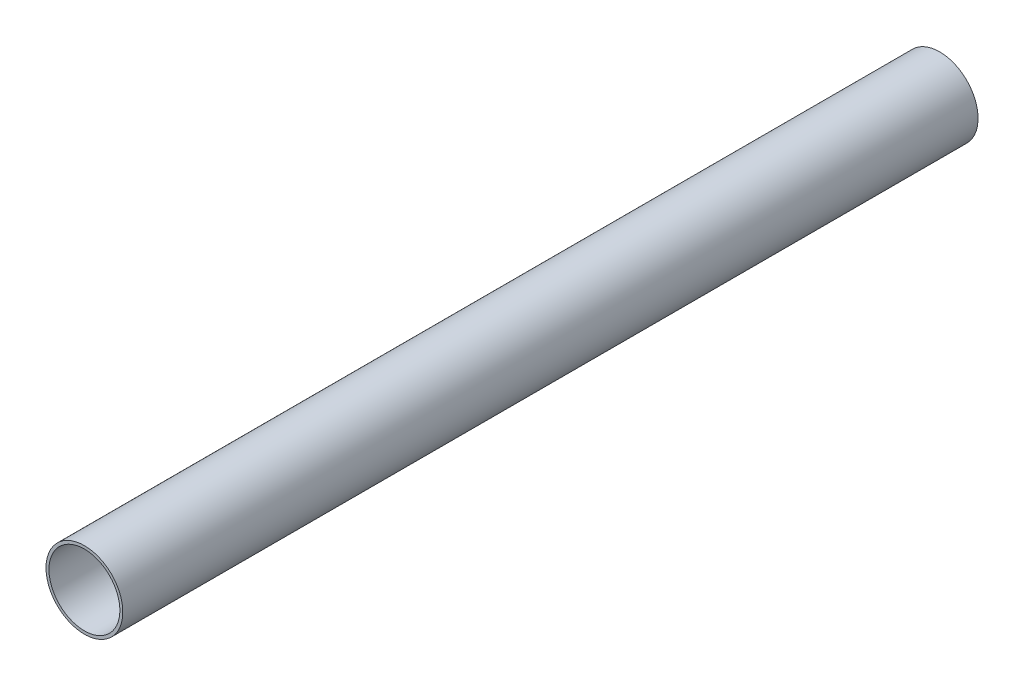
ISO-10303-21;
HEADER;
FILE_DESCRIPTION(('STEP AP214'),'2;1');
FILE_NAME('part.step','',(''),(''),'','','');
FILE_SCHEMA(('AUTOMOTIVE_DESIGN { 1 0 10303 214 1 1 1 1 }'));
ENDSEC;
DATA;
#1=APPLICATION_CONTEXT('core data for automotive mechanical design processes');
#2=APPLICATION_PROTOCOL_DEFINITION('international standard','automotive_design',2000,#1);
#3=PRODUCT_CONTEXT('',#1,'mechanical');
#4=PRODUCT('Part','Part','',(#3));
#5=PRODUCT_RELATED_PRODUCT_CATEGORY('part','',(#4));
#6=PRODUCT_DEFINITION_FORMATION('','',#4);
#7=PRODUCT_DEFINITION_CONTEXT('part definition',#1,'design');
#8=PRODUCT_DEFINITION('design','',#6,#7);
#9=PRODUCT_DEFINITION_SHAPE('','',#8);
#10=(LENGTH_UNIT() NAMED_UNIT(*) SI_UNIT(.MILLI.,.METRE.));
#11=(NAMED_UNIT(*) PLANE_ANGLE_UNIT() SI_UNIT($,.RADIAN.));
#12=(NAMED_UNIT(*) SI_UNIT($,.STERADIAN.) SOLID_ANGLE_UNIT());
#13=UNCERTAINTY_MEASURE_WITH_UNIT(LENGTH_MEASURE(1.E-05),#10,'distance_accuracy_value','');
#14=(GEOMETRIC_REPRESENTATION_CONTEXT(3) GLOBAL_UNCERTAINTY_ASSIGNED_CONTEXT((#13)) GLOBAL_UNIT_ASSIGNED_CONTEXT((#10,
#11,#12)) REPRESENTATION_CONTEXT('',''));
#15=CARTESIAN_POINT('',(0.,0.,0.));
#16=DIRECTION('',(0.,0.,1.));
#17=DIRECTION('',(1.,0.,0.));
#18=AXIS2_PLACEMENT_3D('',#15,#16,#17);
#19=CARTESIAN_POINT('',(0.,0.,609.6));
#20=DIRECTION('',(0.,0.,-1.));
#21=DIRECTION('',(-1.,0.,0.));
#22=AXIS2_PLACEMENT_3D('',#19,#20,#21);
#23=CYLINDRICAL_SURFACE('',#22,20.6375);
#24=CARTESIAN_POINT('',(0.,0.,0.));
#25=DIRECTION('',(0.,0.,1.));
#26=DIRECTION('',(1.,0.,0.));
#27=AXIS2_PLACEMENT_3D('',#24,#25,#26);
#28=CIRCLE('',#27,20.6375);
#29=CARTESIAN_POINT('',(-20.6375,0.,0.));
#30=VERTEX_POINT('',#29);
#31=EDGE_CURVE('E57',#30,#30,#28,.T.);
#32=CARTESIAN_POINT('',(0.,0.,459.600000026));
#33=DIRECTION('',(0.,0.,1.));
#34=DIRECTION('',(1.,0.,0.));
#35=AXIS2_PLACEMENT_3D('',#32,#33,#34);
#36=CIRCLE('',#35,20.6375);
#37=CARTESIAN_POINT('',(-20.6375,0.,459.600000026));
#38=VERTEX_POINT('',#37);
#39=EDGE_CURVE('E11',#38,#38,#36,.T.);
#40=CARTESIAN_POINT('',(-20.6375,0.,0.));
#41=CARTESIAN_POINT('',(-20.6375,0.,4.78750000027084));
#42=CARTESIAN_POINT('',(-20.6375,0.,9.57500000054168));
#43=CARTESIAN_POINT('',(-20.6375,0.,19.1500000010834));
#44=CARTESIAN_POINT('',(-20.6375,0.,23.9375000013542));
#45=CARTESIAN_POINT('',(-20.6375,0.,33.5125000018959));
#46=CARTESIAN_POINT('',(-20.6375,0.,38.3000000021667));
#47=CARTESIAN_POINT('',(-20.6375,0.,47.8750000027084));
#48=CARTESIAN_POINT('',(-20.6375,0.,52.6625000029792));
#49=CARTESIAN_POINT('',(-20.6375,0.,62.2375000035209));
#50=CARTESIAN_POINT('',(-20.6375,0.,67.0250000037917));
#51=CARTESIAN_POINT('',(-20.6375,0.,76.6000000043333));
#52=CARTESIAN_POINT('',(-20.6375,0.,81.3875000046041));
#53=CARTESIAN_POINT('',(-20.6375,0.,90.9625000051458));
#54=CARTESIAN_POINT('',(-20.6375,0.,95.7500000054167));
#55=CARTESIAN_POINT('',(-20.6375,0.,105.325000005958));
#56=CARTESIAN_POINT('',(-20.6375,0.,110.112500006229));
#57=CARTESIAN_POINT('',(-20.6375,0.,119.687500006771));
#58=CARTESIAN_POINT('',(-20.6375,0.,124.475000007042));
#59=CARTESIAN_POINT('',(-20.6375,0.,134.050000007583));
#60=CARTESIAN_POINT('',(-20.6375,0.,138.837500007854));
#61=CARTESIAN_POINT('',(-20.6375,0.,148.412500008396));
#62=CARTESIAN_POINT('',(-20.6375,0.,153.200000008667));
#63=CARTESIAN_POINT('',(-20.6375,0.,162.775000009208));
#64=CARTESIAN_POINT('',(-20.6375,0.,167.562500009479));
#65=CARTESIAN_POINT('',(-20.6375,0.,177.137500010021));
#66=CARTESIAN_POINT('',(-20.6375,0.,181.925000010292));
#67=CARTESIAN_POINT('',(-20.6375,0.,191.500000010833));
#68=CARTESIAN_POINT('',(-20.6375,0.,196.287500011104));
#69=CARTESIAN_POINT('',(-20.6375,0.,205.862500011646));
#70=CARTESIAN_POINT('',(-20.6375,0.,210.650000011917));
#71=CARTESIAN_POINT('',(-20.6375,0.,220.225000012458));
#72=CARTESIAN_POINT('',(-20.6375,0.,225.012500012729));
#73=CARTESIAN_POINT('',(-20.6375,0.,234.587500013271));
#74=CARTESIAN_POINT('',(-20.6375,0.,239.375000013542));
#75=CARTESIAN_POINT('',(-20.6375,0.,248.950000014083));
#76=CARTESIAN_POINT('',(-20.6375,0.,253.737500014354));
#77=CARTESIAN_POINT('',(-20.6375,0.,263.312500014896));
#78=CARTESIAN_POINT('',(-20.6375,0.,268.100000015167));
#79=CARTESIAN_POINT('',(-20.6375,0.,277.675000015708));
#80=CARTESIAN_POINT('',(-20.6375,0.,282.462500015979));
#81=CARTESIAN_POINT('',(-20.6375,0.,292.037500016521));
#82=CARTESIAN_POINT('',(-20.6375,0.,296.825000016792));
#83=CARTESIAN_POINT('',(-20.6375,0.,306.400000017333));
#84=CARTESIAN_POINT('',(-20.6375,0.,311.187500017604));
#85=CARTESIAN_POINT('',(-20.6375,0.,320.762500018146));
#86=CARTESIAN_POINT('',(-20.6375,0.,325.550000018417));
#87=CARTESIAN_POINT('',(-20.6375,0.,335.125000018958));
#88=CARTESIAN_POINT('',(-20.6375,0.,339.912500019229));
#89=CARTESIAN_POINT('',(-20.6375,0.,349.487500019771));
#90=CARTESIAN_POINT('',(-20.6375,0.,354.275000020042));
#91=CARTESIAN_POINT('',(-20.6375,0.,363.850000020583));
#92=CARTESIAN_POINT('',(-20.6375,0.,368.637500020854));
#93=CARTESIAN_POINT('',(-20.6375,0.,378.212500021396));
#94=CARTESIAN_POINT('',(-20.6375,0.,383.000000021667));
#95=CARTESIAN_POINT('',(-20.6375,0.,392.575000022208));
#96=CARTESIAN_POINT('',(-20.6375,0.,397.362500022479));
#97=CARTESIAN_POINT('',(-20.6375,0.,406.937500023021));
#98=CARTESIAN_POINT('',(-20.6375,0.,411.725000023292));
#99=CARTESIAN_POINT('',(-20.6375,0.,421.300000023833));
#100=CARTESIAN_POINT('',(-20.6375,0.,426.087500024104));
#101=CARTESIAN_POINT('',(-20.6375,0.,435.662500024646));
#102=CARTESIAN_POINT('',(-20.6375,0.,440.450000024917));
#103=CARTESIAN_POINT('',(-20.6375,0.,450.025000025458));
#104=CARTESIAN_POINT('',(-20.6375,0.,454.812500025729));
#105=CARTESIAN_POINT('',(-20.6375,0.,459.600000026));
#106=B_SPLINE_CURVE_WITH_KNOTS('',3,(#40,#41,#42,#43,#44,#45,#46,#47,#48,#49,#50,#51,#52,#53,
#54,#55,#56,#57,#58,#59,#60,#61,#62,#63,#64,#65,#66,#67,#68,#69,#70,#71,#72,#73,#74,#75,#76,#77,
#78,#79,#80,#81,#82,#83,#84,#85,#86,#87,#88,#89,#90,#91,#92,#93,#94,#95,#96,#97,#98,#99,#100,
#101,#102,#103,#104,#105),.UNSPECIFIED.,.F.,.F.,(4,2,2,2,2,2,2,2,2,2,2,2,2,2,2,2,2,2,2,2,2,2,2,
2,2,2,2,2,2,2,2,2,4),(0.,14.3625000008125,28.725000001625,43.0875000024376,57.4500000032501,
71.8125000040625,86.175000004875,100.537500005688,114.9000000065,129.262500007312,
143.625000008125,157.987500008937,172.35000000975,186.712500010563,201.075000011375,
215.437500012187,229.800000013,244.162500013813,258.525000014625,272.887500015437,
287.25000001625,301.612500017063,315.975000017875,330.337500018687,344.7000000195,
359.062500020313,373.425000021125,387.787500021937,402.15000002275,416.512500023563,
430.875000024375,445.237500025187,459.600000026),.UNSPECIFIED.);
#107=EDGE_CURVE('BSEAM50',#30,#38,#106,.T.);
#108=ORIENTED_EDGE('',*,*,#31,.T.);
#109=ORIENTED_EDGE('',*,*,#39,.F.);
#110=ORIENTED_EDGE('',*,*,#107,.T.);
#111=ORIENTED_EDGE('',*,*,#107,.F.);
#112=EDGE_LOOP('',(#108,#110,#109,#111));
#113=FACE_BOUND('',#112,.T.);
#114=ADVANCED_FACE('F50',(#113),#23,.T.);
#115=CARTESIAN_POINT('',(0.,0.,609.6));
#116=DIRECTION('',(0.,0.,-1.));
#117=DIRECTION('',(-1.,0.,0.));
#118=AXIS2_PLACEMENT_3D('',#115,#116,#117);
#119=CYLINDRICAL_SURFACE('',#118,19.05);
#120=CARTESIAN_POINT('',(0.,0.,0.));
#121=DIRECTION('',(0.,0.,1.));
#122=DIRECTION('',(1.,0.,0.));
#123=AXIS2_PLACEMENT_3D('',#120,#121,#122);
#124=CIRCLE('',#123,19.05);
#125=CARTESIAN_POINT('',(-19.05,0.,0.));
#126=VERTEX_POINT('',#125);
#127=EDGE_CURVE('E62',#126,#126,#124,.T.);
#128=CARTESIAN_POINT('',(0.,0.,459.600000026));
#129=DIRECTION('',(0.,0.,1.));
#130=DIRECTION('',(1.,0.,0.));
#131=AXIS2_PLACEMENT_3D('',#128,#129,#130);
#132=CIRCLE('',#131,19.05);
#133=CARTESIAN_POINT('',(-19.05,0.,459.600000026));
#134=VERTEX_POINT('',#133);
#135=EDGE_CURVE('E53',#134,#134,#132,.T.);
#136=CARTESIAN_POINT('',(-19.05,0.,0.));
#137=CARTESIAN_POINT('',(-19.05,0.,4.78750000027084));
#138=CARTESIAN_POINT('',(-19.05,0.,9.57500000054168));
#139=CARTESIAN_POINT('',(-19.05,0.,19.1500000010834));
#140=CARTESIAN_POINT('',(-19.05,0.,23.9375000013542));
#141=CARTESIAN_POINT('',(-19.05,0.,33.5125000018959));
#142=CARTESIAN_POINT('',(-19.05,0.,38.3000000021667));
#143=CARTESIAN_POINT('',(-19.05,0.,47.8750000027084));
#144=CARTESIAN_POINT('',(-19.05,0.,52.6625000029792));
#145=CARTESIAN_POINT('',(-19.05,0.,62.2375000035209));
#146=CARTESIAN_POINT('',(-19.05,0.,67.0250000037917));
#147=CARTESIAN_POINT('',(-19.05,0.,76.6000000043333));
#148=CARTESIAN_POINT('',(-19.05,0.,81.3875000046041));
#149=CARTESIAN_POINT('',(-19.05,0.,90.9625000051458));
#150=CARTESIAN_POINT('',(-19.05,0.,95.7500000054167));
#151=CARTESIAN_POINT('',(-19.05,0.,105.325000005958));
#152=CARTESIAN_POINT('',(-19.05,0.,110.112500006229));
#153=CARTESIAN_POINT('',(-19.05,0.,119.687500006771));
#154=CARTESIAN_POINT('',(-19.05,0.,124.475000007042));
#155=CARTESIAN_POINT('',(-19.05,0.,134.050000007583));
#156=CARTESIAN_POINT('',(-19.05,0.,138.837500007854));
#157=CARTESIAN_POINT('',(-19.05,0.,148.412500008396));
#158=CARTESIAN_POINT('',(-19.05,0.,153.200000008667));
#159=CARTESIAN_POINT('',(-19.05,0.,162.775000009208));
#160=CARTESIAN_POINT('',(-19.05,0.,167.562500009479));
#161=CARTESIAN_POINT('',(-19.05,0.,177.137500010021));
#162=CARTESIAN_POINT('',(-19.05,0.,181.925000010292));
#163=CARTESIAN_POINT('',(-19.05,0.,191.500000010833));
#164=CARTESIAN_POINT('',(-19.05,0.,196.287500011104));
#165=CARTESIAN_POINT('',(-19.05,0.,205.862500011646));
#166=CARTESIAN_POINT('',(-19.05,0.,210.650000011917));
#167=CARTESIAN_POINT('',(-19.05,0.,220.225000012458));
#168=CARTESIAN_POINT('',(-19.05,0.,225.012500012729));
#169=CARTESIAN_POINT('',(-19.05,0.,234.587500013271));
#170=CARTESIAN_POINT('',(-19.05,0.,239.375000013542));
#171=CARTESIAN_POINT('',(-19.05,0.,248.950000014083));
#172=CARTESIAN_POINT('',(-19.05,0.,253.737500014354));
#173=CARTESIAN_POINT('',(-19.05,0.,263.312500014896));
#174=CARTESIAN_POINT('',(-19.05,0.,268.100000015167));
#175=CARTESIAN_POINT('',(-19.05,0.,277.675000015708));
#176=CARTESIAN_POINT('',(-19.05,0.,282.462500015979));
#177=CARTESIAN_POINT('',(-19.05,0.,292.037500016521));
#178=CARTESIAN_POINT('',(-19.05,0.,296.825000016792));
#179=CARTESIAN_POINT('',(-19.05,0.,306.400000017333));
#180=CARTESIAN_POINT('',(-19.05,0.,311.187500017604));
#181=CARTESIAN_POINT('',(-19.05,0.,320.762500018146));
#182=CARTESIAN_POINT('',(-19.05,0.,325.550000018417));
#183=CARTESIAN_POINT('',(-19.05,0.,335.125000018958));
#184=CARTESIAN_POINT('',(-19.05,0.,339.912500019229));
#185=CARTESIAN_POINT('',(-19.05,0.,349.487500019771));
#186=CARTESIAN_POINT('',(-19.05,0.,354.275000020042));
#187=CARTESIAN_POINT('',(-19.05,0.,363.850000020583));
#188=CARTESIAN_POINT('',(-19.05,0.,368.637500020854));
#189=CARTESIAN_POINT('',(-19.05,0.,378.212500021396));
#190=CARTESIAN_POINT('',(-19.05,0.,383.000000021667));
#191=CARTESIAN_POINT('',(-19.05,0.,392.575000022208));
#192=CARTESIAN_POINT('',(-19.05,0.,397.362500022479));
#193=CARTESIAN_POINT('',(-19.05,0.,406.937500023021));
#194=CARTESIAN_POINT('',(-19.05,0.,411.725000023292));
#195=CARTESIAN_POINT('',(-19.05,0.,421.300000023833));
#196=CARTESIAN_POINT('',(-19.05,0.,426.087500024104));
#197=CARTESIAN_POINT('',(-19.05,0.,435.662500024646));
#198=CARTESIAN_POINT('',(-19.05,0.,440.450000024917));
#199=CARTESIAN_POINT('',(-19.05,0.,450.025000025458));
#200=CARTESIAN_POINT('',(-19.05,0.,454.812500025729));
#201=CARTESIAN_POINT('',(-19.05,0.,459.600000026));
#202=B_SPLINE_CURVE_WITH_KNOTS('',3,(#136,#137,#138,#139,#140,#141,#142,#143,#144,#145,#146,
#147,#148,#149,#150,#151,#152,#153,#154,#155,#156,#157,#158,#159,#160,#161,#162,#163,#164,#165,
#166,#167,#168,#169,#170,#171,#172,#173,#174,#175,#176,#177,#178,#179,#180,#181,#182,#183,#184,
#185,#186,#187,#188,#189,#190,#191,#192,#193,#194,#195,#196,#197,#198,#199,#200,#201),
.UNSPECIFIED.,.F.,.F.,(4,2,2,2,2,2,2,2,2,2,2,2,2,2,2,2,2,2,2,2,2,2,2,2,2,2,2,2,2,2,2,2,4),(0.,
14.3625000008125,28.725000001625,43.0875000024376,57.4500000032501,71.8125000040625,
86.175000004875,100.537500005688,114.9000000065,129.262500007312,143.625000008125,
157.987500008937,172.35000000975,186.712500010563,201.075000011375,215.437500012187,
229.800000013,244.162500013813,258.525000014625,272.887500015437,287.25000001625,
301.612500017063,315.975000017875,330.337500018687,344.7000000195,359.062500020313,
373.425000021125,387.787500021937,402.15000002275,416.512500023563,430.875000024375,
445.237500025187,459.600000026),.UNSPECIFIED.);
#203=EDGE_CURVE('BSEAM70',#126,#134,#202,.T.);
#204=ORIENTED_EDGE('',*,*,#127,.F.);
#205=ORIENTED_EDGE('',*,*,#135,.T.);
#206=ORIENTED_EDGE('',*,*,#203,.T.);
#207=ORIENTED_EDGE('',*,*,#203,.F.);
#208=EDGE_LOOP('',(#204,#206,#205,#207));
#209=FACE_BOUND('',#208,.T.);
#210=ADVANCED_FACE('F70',(#209),#119,.F.);
#211=CARTESIAN_POINT('',(0.,0.,0.));
#212=DIRECTION('',(0.,0.,1.));
#213=DIRECTION('',(1.,0.,0.));
#214=AXIS2_PLACEMENT_3D('',#211,#212,#213);
#215=PLANE('',#214);
#216=ORIENTED_EDGE('',*,*,#31,.F.);
#217=EDGE_LOOP('',(#216));
#218=FACE_BOUND('',#217,.T.);
#219=ORIENTED_EDGE('',*,*,#127,.T.);
#220=EDGE_LOOP('',(#219));
#221=FACE_BOUND('',#220,.T.);
#222=ADVANCED_FACE('F74',(#218,#221),#215,.F.);
#223=CARTESIAN_POINT('',(0.,0.,459.600000026));
#224=DIRECTION('',(0.,0.,1.));
#225=DIRECTION('',(1.,0.,0.));
#226=AXIS2_PLACEMENT_3D('',#223,#224,#225);
#227=PLANE('',#226);
#228=ORIENTED_EDGE('',*,*,#135,.F.);
#229=EDGE_LOOP('',(#228));
#230=FACE_BOUND('',#229,.T.);
#231=ORIENTED_EDGE('',*,*,#39,.T.);
#232=EDGE_LOOP('',(#231));
#233=FACE_BOUND('',#232,.T.);
#234=ADVANCED_FACE('F72',(#230,#233),#227,.T.);
#235=CLOSED_SHELL('',(#114,#210,#222,#234));
#236=MANIFOLD_SOLID_BREP('B2',#235);
#237=ADVANCED_BREP_SHAPE_REPRESENTATION('',(#18,#236),#14);
#238=SHAPE_DEFINITION_REPRESENTATION(#9,#237);
ENDSEC;
END-ISO-10303-21;
